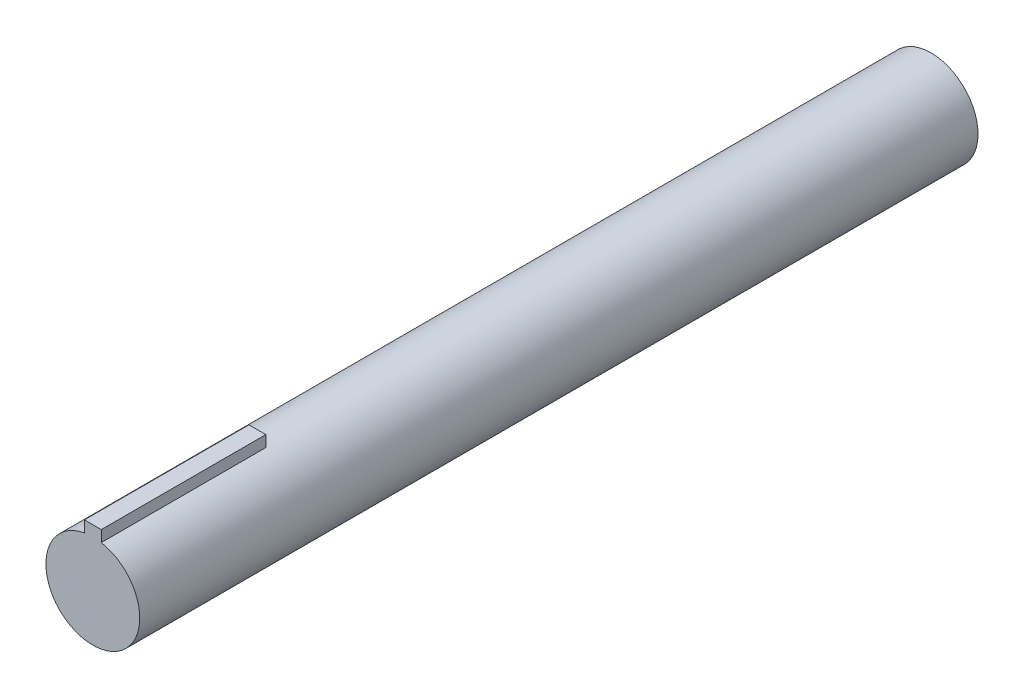
ISO-10303-21;
HEADER;
FILE_DESCRIPTION(('STEP AP214'),'2;1');
FILE_NAME('part.step','',(''),(''),'','','');
FILE_SCHEMA(('AUTOMOTIVE_DESIGN { 1 0 10303 214 1 1 1 1 }'));
ENDSEC;
DATA;
#1=APPLICATION_CONTEXT('core data for automotive mechanical design processes');
#2=APPLICATION_PROTOCOL_DEFINITION('international standard','automotive_design',2000,#1);
#3=PRODUCT_CONTEXT('',#1,'mechanical');
#4=PRODUCT('Part','Part','',(#3));
#5=PRODUCT_RELATED_PRODUCT_CATEGORY('part','',(#4));
#6=PRODUCT_DEFINITION_FORMATION('','',#4);
#7=PRODUCT_DEFINITION_CONTEXT('part definition',#1,'design');
#8=PRODUCT_DEFINITION('design','',#6,#7);
#9=PRODUCT_DEFINITION_SHAPE('','',#8);
#10=(LENGTH_UNIT() NAMED_UNIT(*) SI_UNIT(.MILLI.,.METRE.));
#11=(NAMED_UNIT(*) PLANE_ANGLE_UNIT() SI_UNIT($,.RADIAN.));
#12=(NAMED_UNIT(*) SI_UNIT($,.STERADIAN.) SOLID_ANGLE_UNIT());
#13=UNCERTAINTY_MEASURE_WITH_UNIT(LENGTH_MEASURE(1.E-05),#10,'distance_accuracy_value','');
#14=(GEOMETRIC_REPRESENTATION_CONTEXT(3) GLOBAL_UNCERTAINTY_ASSIGNED_CONTEXT((#13)) GLOBAL_UNIT_ASSIGNED_CONTEXT((#10,
#11,#12)) REPRESENTATION_CONTEXT('',''));
#15=CARTESIAN_POINT('',(0.,0.,0.));
#16=DIRECTION('',(0.,0.,1.));
#17=DIRECTION('',(1.,0.,0.));
#18=AXIS2_PLACEMENT_3D('',#15,#16,#17);
#19=CARTESIAN_POINT('',(-53.0995006518498,8.0105490154106,0.));
#20=DIRECTION('',(0.,0.,1.));
#21=DIRECTION('',(1.,0.,0.));
#22=AXIS2_PLACEMENT_3D('',#19,#20,#21);
#23=PLANE('',#22);
#24=CARTESIAN_POINT('',(-53.0995006518498,8.0105490154106,0.));
#25=DIRECTION('',(0.,0.,-1.));
#26=DIRECTION('',(-1.,0.,0.));
#27=AXIS2_PLACEMENT_3D('',#24,#25,#26);
#28=CIRCLE('',#27,2.5);
#29=CARTESIAN_POINT('',(-53.5495006518498,10.4697155408822,0.));
#30=VERTEX_POINT('',#29);
#31=CARTESIAN_POINT('',(-52.6495006518498,10.4697155408822,0.));
#32=VERTEX_POINT('',#31);
#33=EDGE_CURVE('E144',#30,#32,#28,.T.);
#34=ORIENTED_EDGE('',*,*,#33,.F.);
#35=DIRECTION('',(0.,-1.,0.));
#36=VECTOR('',#35,1.);
#37=CARTESIAN_POINT('',(-53.5495006518498,10.4697155408822,0.));
#38=LINE('',#37,#36);
#39=CARTESIAN_POINT('',(-53.5495006518498,11.0697155408822,0.));
#40=VERTEX_POINT('',#39);
#41=EDGE_CURVE('E150',#40,#30,#38,.T.);
#42=ORIENTED_EDGE('',*,*,#41,.F.);
#43=DIRECTION('',(-1.,0.,0.));
#44=VECTOR('',#43,1.);
#45=CARTESIAN_POINT('',(-53.5495006518498,11.0697155408822,0.));
#46=LINE('',#45,#44);
#47=CARTESIAN_POINT('',(-52.6495006518498,11.0697155408822,0.));
#48=VERTEX_POINT('',#47);
#49=EDGE_CURVE('E84',#48,#40,#46,.T.);
#50=ORIENTED_EDGE('',*,*,#49,.F.);
#51=DIRECTION('',(0.,1.,0.));
#52=VECTOR('',#51,1.);
#53=CARTESIAN_POINT('',(-52.6495006518498,10.4697155408822,0.));
#54=LINE('',#53,#52);
#55=EDGE_CURVE('E147',#32,#48,#54,.T.);
#56=ORIENTED_EDGE('',*,*,#55,.F.);
#57=EDGE_LOOP('',(#34,#42,#50,#56));
#58=FACE_BOUND('',#57,.T.);
#59=ADVANCED_FACE('F41',(#58),#23,.F.);
#60=CARTESIAN_POINT('',(-53.0995006518498,8.0105490154106,8.77));
#61=DIRECTION('',(0.,0.,-1.));
#62=DIRECTION('',(-1.,0.,0.));
#63=AXIS2_PLACEMENT_3D('',#60,#61,#62);
#64=CYLINDRICAL_SURFACE('',#63,2.5);
#65=DIRECTION('',(0.,0.,-1.));
#66=VECTOR('',#65,1.);
#67=CARTESIAN_POINT('',(-53.5495006518498,10.4697155408822,8.77));
#68=LINE('',#67,#66);
#69=CARTESIAN_POINT('',(-53.5495006518498,10.4697155408822,8.77));
#70=VERTEX_POINT('',#69);
#71=EDGE_CURVE('E155',#70,#30,#68,.T.);
#72=ORIENTED_EDGE('',*,*,#71,.T.);
#73=ORIENTED_EDGE('',*,*,#33,.T.);
#74=DIRECTION('',(0.,0.,-1.));
#75=VECTOR('',#74,1.);
#76=CARTESIAN_POINT('',(-52.6495006518498,10.4697155408822,8.77));
#77=LINE('',#76,#75);
#78=CARTESIAN_POINT('',(-52.6495006518498,10.4697155408822,8.77));
#79=VERTEX_POINT('',#78);
#80=EDGE_CURVE('E11',#79,#32,#77,.T.);
#81=ORIENTED_EDGE('',*,*,#80,.F.);
#82=CARTESIAN_POINT('',(-53.0995006518498,8.0105490154106,8.77));
#83=DIRECTION('',(0.,0.,1.));
#84=DIRECTION('',(1.,0.,0.));
#85=AXIS2_PLACEMENT_3D('',#82,#83,#84);
#86=CIRCLE('',#85,2.5);
#87=EDGE_CURVE('E148',#70,#79,#86,.T.);
#88=ORIENTED_EDGE('',*,*,#87,.F.);
#89=EDGE_LOOP('',(#72,#73,#81,#88));
#90=FACE_BOUND('',#89,.T.);
#91=CARTESIAN_POINT('',(-53.0995006570658,8.01054899042436,-25.9));
#92=DIRECTION('',(0.,0.,-1.));
#93=DIRECTION('',(-1.,0.,0.));
#94=AXIS2_PLACEMENT_3D('',#91,#92,#93);
#95=CIRCLE('',#94,2.49999997542187);
#96=CARTESIAN_POINT('',(-52.6495006518498,5.55138248993901,-25.9));
#97=VERTEX_POINT('',#96);
#98=CARTESIAN_POINT('',(-53.5495006518498,5.55138248993901,-25.9));
#99=VERTEX_POINT('',#98);
#100=EDGE_CURVE('E123',#97,#99,#95,.T.);
#101=ORIENTED_EDGE('',*,*,#100,.F.);
#102=DIRECTION('',(0.,0.,-1.));
#103=VECTOR('',#102,1.);
#104=CARTESIAN_POINT('',(-52.6495006518498,5.55138248993901,-25.9));
#105=LINE('',#104,#103);
#106=CARTESIAN_POINT('',(-52.6495006518498,5.55138248993901,-35.9));
#107=VERTEX_POINT('',#106);
#108=EDGE_CURVE('E145',#97,#107,#105,.T.);
#109=ORIENTED_EDGE('',*,*,#108,.T.);
#110=CARTESIAN_POINT('',(-53.0995006518498,8.0105490154106,-35.9));
#111=DIRECTION('',(0.,0.,-1.));
#112=DIRECTION('',(-1.,0.,0.));
#113=AXIS2_PLACEMENT_3D('',#110,#111,#112);
#114=CIRCLE('',#113,2.5);
#115=CARTESIAN_POINT('',(-53.5495006518498,5.55138248993901,-35.9));
#116=VERTEX_POINT('',#115);
#117=EDGE_CURVE('E136',#116,#107,#114,.T.);
#118=ORIENTED_EDGE('',*,*,#117,.F.);
#119=DIRECTION('',(0.,0.,-1.));
#120=VECTOR('',#119,1.);
#121=CARTESIAN_POINT('',(-53.5495006518498,5.55138248993901,-25.9));
#122=LINE('',#121,#120);
#123=EDGE_CURVE('E56',#99,#116,#122,.T.);
#124=ORIENTED_EDGE('',*,*,#123,.F.);
#125=EDGE_LOOP('',(#101,#109,#118,#124));
#126=FACE_BOUND('',#125,.T.);
#127=ADVANCED_FACE('F43',(#90,#126),#64,.T.);
#128=CARTESIAN_POINT('',(-52.6495006518498,10.4697155408822,8.77));
#129=DIRECTION('',(-1.,0.,0.));
#130=DIRECTION('',(0.,0.,1.));
#131=AXIS2_PLACEMENT_3D('',#128,#129,#130);
#132=PLANE('',#131);
#133=ORIENTED_EDGE('',*,*,#55,.T.);
#134=DIRECTION('',(0.,0.,-1.));
#135=VECTOR('',#134,1.);
#136=CARTESIAN_POINT('',(-52.6495006518498,11.0697155408822,8.77));
#137=LINE('',#136,#135);
#138=CARTESIAN_POINT('',(-52.6495006518498,11.0697155408822,8.77));
#139=VERTEX_POINT('',#138);
#140=EDGE_CURVE('E49',#139,#48,#137,.T.);
#141=ORIENTED_EDGE('',*,*,#140,.F.);
#142=DIRECTION('',(0.,1.,0.));
#143=VECTOR('',#142,1.);
#144=CARTESIAN_POINT('',(-52.6495006518498,10.4697155408822,8.77));
#145=LINE('',#144,#143);
#146=EDGE_CURVE('E91',#79,#139,#145,.T.);
#147=ORIENTED_EDGE('',*,*,#146,.F.);
#148=ORIENTED_EDGE('',*,*,#80,.T.);
#149=EDGE_LOOP('',(#133,#141,#147,#148));
#150=FACE_BOUND('',#149,.T.);
#151=ADVANCED_FACE('F192',(#150),#132,.F.);
#152=CARTESIAN_POINT('',(-53.5495006518498,11.0697155408822,8.77));
#153=DIRECTION('',(0.,-1.,0.));
#154=DIRECTION('',(0.,0.,-1.));
#155=AXIS2_PLACEMENT_3D('',#152,#153,#154);
#156=PLANE('',#155);
#157=ORIENTED_EDGE('',*,*,#49,.T.);
#158=DIRECTION('',(0.,0.,-1.));
#159=VECTOR('',#158,1.);
#160=CARTESIAN_POINT('',(-53.5495006518498,11.0697155408822,8.77));
#161=LINE('',#160,#159);
#162=CARTESIAN_POINT('',(-53.5495006518498,11.0697155408822,8.77));
#163=VERTEX_POINT('',#162);
#164=EDGE_CURVE('E162',#163,#40,#161,.T.);
#165=ORIENTED_EDGE('',*,*,#164,.F.);
#166=DIRECTION('',(-1.,0.,0.));
#167=VECTOR('',#166,1.);
#168=CARTESIAN_POINT('',(-53.5495006518498,11.0697155408822,8.77));
#169=LINE('',#168,#167);
#170=EDGE_CURVE('E152',#139,#163,#169,.T.);
#171=ORIENTED_EDGE('',*,*,#170,.F.);
#172=ORIENTED_EDGE('',*,*,#140,.T.);
#173=EDGE_LOOP('',(#157,#165,#171,#172));
#174=FACE_BOUND('',#173,.T.);
#175=ADVANCED_FACE('F164',(#174),#156,.F.);
#176=CARTESIAN_POINT('',(-53.5495006518498,10.4697155408822,8.77));
#177=DIRECTION('',(1.,0.,0.));
#178=DIRECTION('',(0.,0.,-1.));
#179=AXIS2_PLACEMENT_3D('',#176,#177,#178);
#180=PLANE('',#179);
#181=ORIENTED_EDGE('',*,*,#41,.T.);
#182=ORIENTED_EDGE('',*,*,#71,.F.);
#183=DIRECTION('',(0.,-1.,0.));
#184=VECTOR('',#183,1.);
#185=CARTESIAN_POINT('',(-53.5495006518498,10.4697155408822,8.77));
#186=LINE('',#185,#184);
#187=EDGE_CURVE('E65',#163,#70,#186,.T.);
#188=ORIENTED_EDGE('',*,*,#187,.F.);
#189=ORIENTED_EDGE('',*,*,#164,.T.);
#190=EDGE_LOOP('',(#181,#182,#188,#189));
#191=FACE_BOUND('',#190,.T.);
#192=ADVANCED_FACE('F169',(#191),#180,.F.);
#193=CARTESIAN_POINT('',(-53.0995006518498,8.0105490154106,8.77));
#194=DIRECTION('',(0.,0.,1.));
#195=DIRECTION('',(1.,0.,0.));
#196=AXIS2_PLACEMENT_3D('',#193,#194,#195);
#197=PLANE('',#196);
#198=ORIENTED_EDGE('',*,*,#87,.T.);
#199=ORIENTED_EDGE('',*,*,#146,.T.);
#200=ORIENTED_EDGE('',*,*,#170,.T.);
#201=ORIENTED_EDGE('',*,*,#187,.T.);
#202=EDGE_LOOP('',(#198,#199,#200,#201));
#203=FACE_BOUND('',#202,.T.);
#204=ADVANCED_FACE('F173',(#203),#197,.T.);
#205=CARTESIAN_POINT('',(-53.0995006518498,8.0105490154106,-35.9));
#206=DIRECTION('',(0.,0.,-1.));
#207=DIRECTION('',(-1.,0.,0.));
#208=AXIS2_PLACEMENT_3D('',#205,#206,#207);
#209=PLANE('',#208);
#210=DIRECTION('',(0.,-1.,0.));
#211=VECTOR('',#210,1.);
#212=CARTESIAN_POINT('',(-52.6495006518498,6.15138248993901,-35.9));
#213=LINE('',#212,#211);
#214=CARTESIAN_POINT('',(-52.6495006518498,6.15138248993901,-35.9));
#215=VERTEX_POINT('',#214);
#216=EDGE_CURVE('E132',#215,#107,#213,.T.);
#217=ORIENTED_EDGE('',*,*,#216,.F.);
#218=DIRECTION('',(1.,0.,0.));
#219=VECTOR('',#218,1.);
#220=CARTESIAN_POINT('',(-52.6495006518498,6.15138248993901,-35.9));
#221=LINE('',#220,#219);
#222=CARTESIAN_POINT('',(-53.5495006518498,6.15138248993901,-35.9));
#223=VERTEX_POINT('',#222);
#224=EDGE_CURVE('E275',#223,#215,#221,.T.);
#225=ORIENTED_EDGE('',*,*,#224,.F.);
#226=DIRECTION('',(0.,1.,0.));
#227=VECTOR('',#226,1.);
#228=CARTESIAN_POINT('',(-53.5495006518498,6.15138248993901,-35.9));
#229=LINE('',#228,#227);
#230=EDGE_CURVE('E277',#116,#223,#229,.T.);
#231=ORIENTED_EDGE('',*,*,#230,.F.);
#232=ORIENTED_EDGE('',*,*,#117,.T.);
#233=EDGE_LOOP('',(#217,#225,#231,#232));
#234=FACE_BOUND('',#233,.T.);
#235=ADVANCED_FACE('F175',(#234),#209,.T.);
#236=CARTESIAN_POINT('',(-52.6495006518498,6.15138248993901,-25.9));
#237=DIRECTION('',(1.,0.,0.));
#238=DIRECTION('',(0.,0.,-1.));
#239=AXIS2_PLACEMENT_3D('',#236,#237,#238);
#240=PLANE('',#239);
#241=ORIENTED_EDGE('',*,*,#216,.T.);
#242=ORIENTED_EDGE('',*,*,#108,.F.);
#243=DIRECTION('',(0.,-1.,0.));
#244=VECTOR('',#243,1.);
#245=CARTESIAN_POINT('',(-52.6495006518498,6.15138248993901,-25.9));
#246=LINE('',#245,#244);
#247=CARTESIAN_POINT('',(-52.6495006518498,6.15138248993901,-25.9));
#248=VERTEX_POINT('',#247);
#249=EDGE_CURVE('E129',#248,#97,#246,.T.);
#250=ORIENTED_EDGE('',*,*,#249,.F.);
#251=DIRECTION('',(0.,0.,-1.));
#252=VECTOR('',#251,1.);
#253=CARTESIAN_POINT('',(-52.6495006518498,6.15138248993901,-25.9));
#254=LINE('',#253,#252);
#255=EDGE_CURVE('E138',#248,#215,#254,.T.);
#256=ORIENTED_EDGE('',*,*,#255,.T.);
#257=EDGE_LOOP('',(#241,#242,#250,#256));
#258=FACE_BOUND('',#257,.T.);
#259=ADVANCED_FACE('F182',(#258),#240,.F.);
#260=CARTESIAN_POINT('',(-52.6495006518498,6.15138248993901,-25.9));
#261=DIRECTION('',(0.,1.,0.));
#262=DIRECTION('',(0.,0.,1.));
#263=AXIS2_PLACEMENT_3D('',#260,#261,#262);
#264=PLANE('',#263);
#265=ORIENTED_EDGE('',*,*,#224,.T.);
#266=ORIENTED_EDGE('',*,*,#255,.F.);
#267=DIRECTION('',(1.,0.,0.));
#268=VECTOR('',#267,1.);
#269=CARTESIAN_POINT('',(-52.6495006518498,6.15138248993901,-25.9));
#270=LINE('',#269,#268);
#271=CARTESIAN_POINT('',(-53.5495006518498,6.15138248993901,-25.9));
#272=VERTEX_POINT('',#271);
#273=EDGE_CURVE('E122',#272,#248,#270,.T.);
#274=ORIENTED_EDGE('',*,*,#273,.F.);
#275=DIRECTION('',(0.,0.,-1.));
#276=VECTOR('',#275,1.);
#277=CARTESIAN_POINT('',(-53.5495006518498,6.15138248993901,-25.9));
#278=LINE('',#277,#276);
#279=EDGE_CURVE('E118',#272,#223,#278,.T.);
#280=ORIENTED_EDGE('',*,*,#279,.T.);
#281=EDGE_LOOP('',(#265,#266,#274,#280));
#282=FACE_BOUND('',#281,.T.);
#283=ADVANCED_FACE('F220',(#282),#264,.F.);
#284=CARTESIAN_POINT('',(-53.5495006518498,6.15138248993901,-25.9));
#285=DIRECTION('',(-1.,0.,0.));
#286=DIRECTION('',(0.,0.,1.));
#287=AXIS2_PLACEMENT_3D('',#284,#285,#286);
#288=PLANE('',#287);
#289=ORIENTED_EDGE('',*,*,#230,.T.);
#290=ORIENTED_EDGE('',*,*,#279,.F.);
#291=DIRECTION('',(0.,1.,0.));
#292=VECTOR('',#291,1.);
#293=CARTESIAN_POINT('',(-53.5495006518498,6.15138248993901,-25.9));
#294=LINE('',#293,#292);
#295=EDGE_CURVE('E115',#99,#272,#294,.T.);
#296=ORIENTED_EDGE('',*,*,#295,.F.);
#297=ORIENTED_EDGE('',*,*,#123,.T.);
#298=EDGE_LOOP('',(#289,#290,#296,#297));
#299=FACE_BOUND('',#298,.T.);
#300=ADVANCED_FACE('F117',(#299),#288,.F.);
#301=CARTESIAN_POINT('',(-53.0995006570658,8.01054899042436,-25.9));
#302=DIRECTION('',(0.,0.,-1.));
#303=DIRECTION('',(-1.,0.,0.));
#304=AXIS2_PLACEMENT_3D('',#301,#302,#303);
#305=PLANE('',#304);
#306=ORIENTED_EDGE('',*,*,#100,.T.);
#307=ORIENTED_EDGE('',*,*,#295,.T.);
#308=ORIENTED_EDGE('',*,*,#273,.T.);
#309=ORIENTED_EDGE('',*,*,#249,.T.);
#310=EDGE_LOOP('',(#306,#307,#308,#309));
#311=FACE_BOUND('',#310,.T.);
#312=ADVANCED_FACE('F127',(#311),#305,.T.);
#313=CLOSED_SHELL('',(#59,#127,#151,#175,#192,#204,#235,#259,#283,#300,#312));
#314=MANIFOLD_SOLID_BREP('B2',#313);
#315=ADVANCED_BREP_SHAPE_REPRESENTATION('',(#18,#314),#14);
#316=SHAPE_DEFINITION_REPRESENTATION(#9,#315);
ENDSEC;
END-ISO-10303-21;
